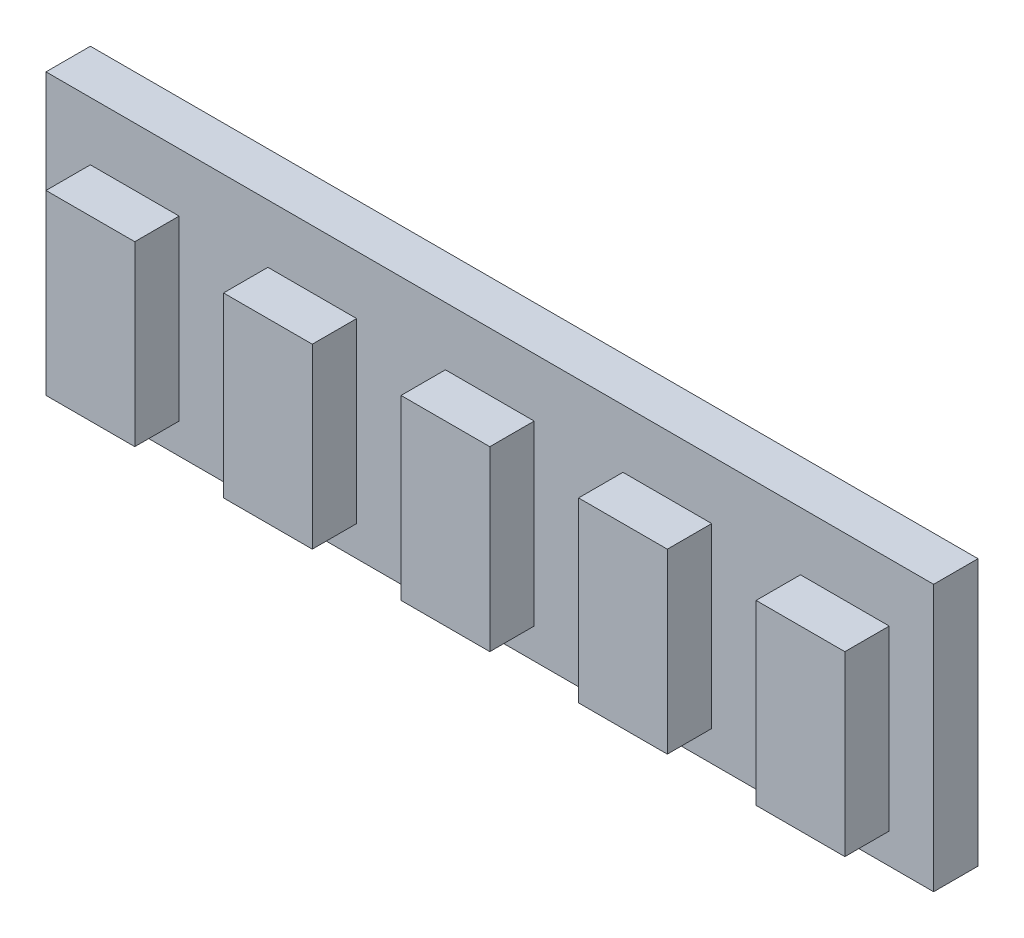
ISO-10303-21;
HEADER;
FILE_DESCRIPTION(('STEP AP214'),'2;1');
FILE_NAME('part.step','',(''),(''),'','','');
FILE_SCHEMA(('AUTOMOTIVE_DESIGN { 1 0 10303 214 1 1 1 1 }'));
ENDSEC;
DATA;
#1=APPLICATION_CONTEXT('core data for automotive mechanical design processes');
#2=APPLICATION_PROTOCOL_DEFINITION('international standard','automotive_design',2000,#1);
#3=PRODUCT_CONTEXT('',#1,'mechanical');
#4=PRODUCT('Part','Part','',(#3));
#5=PRODUCT_RELATED_PRODUCT_CATEGORY('part','',(#4));
#6=PRODUCT_DEFINITION_FORMATION('','',#4);
#7=PRODUCT_DEFINITION_CONTEXT('part definition',#1,'design');
#8=PRODUCT_DEFINITION('design','',#6,#7);
#9=PRODUCT_DEFINITION_SHAPE('','',#8);
#10=(LENGTH_UNIT() NAMED_UNIT(*) SI_UNIT(.MILLI.,.METRE.));
#11=(NAMED_UNIT(*) PLANE_ANGLE_UNIT() SI_UNIT($,.RADIAN.));
#12=(NAMED_UNIT(*) SI_UNIT($,.STERADIAN.) SOLID_ANGLE_UNIT());
#13=UNCERTAINTY_MEASURE_WITH_UNIT(LENGTH_MEASURE(1.E-05),#10,'distance_accuracy_value','');
#14=(GEOMETRIC_REPRESENTATION_CONTEXT(3) GLOBAL_UNCERTAINTY_ASSIGNED_CONTEXT((#13)) GLOBAL_UNIT_ASSIGNED_CONTEXT((#10,
#11,#12)) REPRESENTATION_CONTEXT('',''));
#15=CARTESIAN_POINT('',(0.,0.,0.));
#16=DIRECTION('',(0.,0.,1.));
#17=DIRECTION('',(1.,0.,0.));
#18=AXIS2_PLACEMENT_3D('',#15,#16,#17);
#19=CARTESIAN_POINT('',(80.,0.,10.));
#20=DIRECTION('',(0.,0.,1.));
#21=DIRECTION('',(1.,0.,0.));
#22=AXIS2_PLACEMENT_3D('',#19,#20,#21);
#23=PLANE('',#22);
#24=DIRECTION('',(0.,-1.,0.));
#25=VECTOR('',#24,1.);
#26=CARTESIAN_POINT('',(53.4403669724771,12.1433048584863,10.));
#27=LINE('',#26,#25);
#28=CARTESIAN_POINT('',(53.4403669724771,12.1433048584863,10.));
#29=VERTEX_POINT('',#28);
#30=CARTESIAN_POINT('',(53.4403669724771,-7.85669514151371,10.));
#31=VERTEX_POINT('',#30);
#32=EDGE_CURVE('E434',#29,#31,#27,.T.);
#33=ORIENTED_EDGE('',*,*,#32,.T.);
#34=DIRECTION('',(1.,0.,0.));
#35=VECTOR('',#34,1.);
#36=CARTESIAN_POINT('',(53.4403669724771,-7.85669514151371,10.));
#37=LINE('',#36,#35);
#38=CARTESIAN_POINT('',(63.4403669724771,-7.85669514151371,10.));
#39=VERTEX_POINT('',#38);
#40=EDGE_CURVE('E444',#31,#39,#37,.T.);
#41=ORIENTED_EDGE('',*,*,#40,.T.);
#42=DIRECTION('',(0.,1.,0.));
#43=VECTOR('',#42,1.);
#44=CARTESIAN_POINT('',(63.4403669724771,12.1433048584863,10.));
#45=LINE('',#44,#43);
#46=CARTESIAN_POINT('',(63.4403669724771,12.1433048584863,10.));
#47=VERTEX_POINT('',#46);
#48=EDGE_CURVE('E47',#39,#47,#45,.T.);
#49=ORIENTED_EDGE('',*,*,#48,.T.);
#50=DIRECTION('',(-1.,0.,0.));
#51=VECTOR('',#50,1.);
#52=CARTESIAN_POINT('',(53.4403669724771,12.1433048584863,10.));
#53=LINE('',#52,#51);
#54=EDGE_CURVE('E11',#47,#29,#53,.T.);
#55=ORIENTED_EDGE('',*,*,#54,.T.);
#56=EDGE_LOOP('',(#33,#41,#49,#55));
#57=FACE_BOUND('',#56,.T.);
#58=ADVANCED_FACE('F39',(#57),#23,.T.);
#59=CARTESIAN_POINT('',(53.4403669724771,12.1433048584863,10.));
#60=DIRECTION('',(0.,-1.,0.));
#61=DIRECTION('',(1.,0.,0.));
#62=AXIS2_PLACEMENT_3D('',#59,#60,#61);
#63=PLANE('',#62);
#64=DIRECTION('',(-1.,0.,0.));
#65=VECTOR('',#64,1.);
#66=CARTESIAN_POINT('',(53.4403669724771,12.1433048584863,5.));
#67=LINE('',#66,#65);
#68=CARTESIAN_POINT('',(63.4403669724771,12.1433048584863,5.));
#69=VERTEX_POINT('',#68);
#70=CARTESIAN_POINT('',(53.4403669724771,12.1433048584863,5.));
#71=VERTEX_POINT('',#70);
#72=EDGE_CURVE('E420',#69,#71,#67,.T.);
#73=ORIENTED_EDGE('',*,*,#72,.T.);
#74=DIRECTION('',(0.,0.,-1.));
#75=VECTOR('',#74,1.);
#76=CARTESIAN_POINT('',(53.4403669724771,12.1433048584863,10.));
#77=LINE('',#76,#75);
#78=EDGE_CURVE('E438',#29,#71,#77,.T.);
#79=ORIENTED_EDGE('',*,*,#78,.F.);
#80=ORIENTED_EDGE('',*,*,#54,.F.);
#81=DIRECTION('',(0.,0.,-1.));
#82=VECTOR('',#81,1.);
#83=CARTESIAN_POINT('',(63.4403669724771,12.1433048584863,10.));
#84=LINE('',#83,#82);
#85=EDGE_CURVE('E54',#47,#69,#84,.T.);
#86=ORIENTED_EDGE('',*,*,#85,.T.);
#87=EDGE_LOOP('',(#73,#79,#80,#86));
#88=FACE_BOUND('',#87,.T.);
#89=ADVANCED_FACE('F453',(#88),#63,.F.);
#90=CARTESIAN_POINT('',(63.4403669724771,12.1433048584863,10.));
#91=DIRECTION('',(-1.,0.,0.));
#92=DIRECTION('',(0.,0.,1.));
#93=AXIS2_PLACEMENT_3D('',#90,#91,#92);
#94=PLANE('',#93);
#95=DIRECTION('',(0.,1.,0.));
#96=VECTOR('',#95,1.);
#97=CARTESIAN_POINT('',(63.4403669724771,12.1433048584863,5.));
#98=LINE('',#97,#96);
#99=CARTESIAN_POINT('',(63.4403669724771,-7.85669514151371,5.));
#100=VERTEX_POINT('',#99);
#101=EDGE_CURVE('E424',#100,#69,#98,.T.);
#102=ORIENTED_EDGE('',*,*,#101,.T.);
#103=ORIENTED_EDGE('',*,*,#85,.F.);
#104=ORIENTED_EDGE('',*,*,#48,.F.);
#105=DIRECTION('',(0.,0.,-1.));
#106=VECTOR('',#105,1.);
#107=CARTESIAN_POINT('',(63.4403669724771,-7.85669514151371,10.));
#108=LINE('',#107,#106);
#109=EDGE_CURVE('E62',#39,#100,#108,.T.);
#110=ORIENTED_EDGE('',*,*,#109,.T.);
#111=EDGE_LOOP('',(#102,#103,#104,#110));
#112=FACE_BOUND('',#111,.T.);
#113=ADVANCED_FACE('F459',(#112),#94,.F.);
#114=CARTESIAN_POINT('',(53.4403669724771,-7.85669514151371,10.));
#115=DIRECTION('',(0.,1.,0.));
#116=DIRECTION('',(0.,0.,1.));
#117=AXIS2_PLACEMENT_3D('',#114,#115,#116);
#118=PLANE('',#117);
#119=DIRECTION('',(1.,0.,0.));
#120=VECTOR('',#119,1.);
#121=CARTESIAN_POINT('',(53.4403669724771,-7.85669514151371,5.));
#122=LINE('',#121,#120);
#123=CARTESIAN_POINT('',(53.4403669724771,-7.85669514151371,5.));
#124=VERTEX_POINT('',#123);
#125=EDGE_CURVE('E427',#124,#100,#122,.T.);
#126=ORIENTED_EDGE('',*,*,#125,.T.);
#127=ORIENTED_EDGE('',*,*,#109,.F.);
#128=ORIENTED_EDGE('',*,*,#40,.F.);
#129=DIRECTION('',(0.,0.,-1.));
#130=VECTOR('',#129,1.);
#131=CARTESIAN_POINT('',(53.4403669724771,-7.85669514151371,10.));
#132=LINE('',#131,#130);
#133=EDGE_CURVE('E430',#31,#124,#132,.T.);
#134=ORIENTED_EDGE('',*,*,#133,.T.);
#135=EDGE_LOOP('',(#126,#127,#128,#134));
#136=FACE_BOUND('',#135,.T.);
#137=ADVANCED_FACE('F457',(#136),#118,.F.);
#138=CARTESIAN_POINT('',(53.4403669724771,12.1433048584863,10.));
#139=DIRECTION('',(1.,0.,0.));
#140=DIRECTION('',(0.,1.,0.));
#141=AXIS2_PLACEMENT_3D('',#138,#139,#140);
#142=PLANE('',#141);
#143=DIRECTION('',(0.,-1.,0.));
#144=VECTOR('',#143,1.);
#145=CARTESIAN_POINT('',(53.4403669724771,12.1433048584863,5.));
#146=LINE('',#145,#144);
#147=EDGE_CURVE('E417',#71,#124,#146,.T.);
#148=ORIENTED_EDGE('',*,*,#147,.T.);
#149=ORIENTED_EDGE('',*,*,#133,.F.);
#150=ORIENTED_EDGE('',*,*,#32,.F.);
#151=ORIENTED_EDGE('',*,*,#78,.T.);
#152=EDGE_LOOP('',(#148,#149,#150,#151));
#153=FACE_BOUND('',#152,.T.);
#154=ADVANCED_FACE('F455',(#153),#142,.F.);
#155=CARTESIAN_POINT('',(60.,0.,10.));
#156=DIRECTION('',(0.,0.,1.));
#157=DIRECTION('',(1.,0.,0.));
#158=AXIS2_PLACEMENT_3D('',#155,#156,#157);
#159=PLANE('',#158);
#160=DIRECTION('',(0.,-1.,0.));
#161=VECTOR('',#160,1.);
#162=CARTESIAN_POINT('',(33.4403669724771,12.1433048584863,10.));
#163=LINE('',#162,#161);
#164=CARTESIAN_POINT('',(33.4403669724771,12.1433048584863,10.));
#165=VERTEX_POINT('',#164);
#166=CARTESIAN_POINT('',(33.4403669724771,-7.85669514151371,10.));
#167=VERTEX_POINT('',#166);
#168=EDGE_CURVE('E389',#165,#167,#163,.T.);
#169=ORIENTED_EDGE('',*,*,#168,.T.);
#170=DIRECTION('',(1.,0.,0.));
#171=VECTOR('',#170,1.);
#172=CARTESIAN_POINT('',(33.4403669724771,-7.85669514151371,10.));
#173=LINE('',#172,#171);
#174=CARTESIAN_POINT('',(43.4403669724771,-7.85669514151371,10.));
#175=VERTEX_POINT('',#174);
#176=EDGE_CURVE('E401',#167,#175,#173,.T.);
#177=ORIENTED_EDGE('',*,*,#176,.T.);
#178=DIRECTION('',(0.,1.,0.));
#179=VECTOR('',#178,1.);
#180=CARTESIAN_POINT('',(43.4403669724771,12.1433048584863,10.));
#181=LINE('',#180,#179);
#182=CARTESIAN_POINT('',(43.4403669724771,12.1433048584863,10.));
#183=VERTEX_POINT('',#182);
#184=EDGE_CURVE('E409',#175,#183,#181,.T.);
#185=ORIENTED_EDGE('',*,*,#184,.T.);
#186=DIRECTION('',(-1.,0.,0.));
#187=VECTOR('',#186,1.);
#188=CARTESIAN_POINT('',(33.4403669724771,12.1433048584863,10.));
#189=LINE('',#188,#187);
#190=EDGE_CURVE('E413',#183,#165,#189,.T.);
#191=ORIENTED_EDGE('',*,*,#190,.T.);
#192=EDGE_LOOP('',(#169,#177,#185,#191));
#193=FACE_BOUND('',#192,.T.);
#194=ADVANCED_FACE('F492',(#193),#159,.T.);
#195=CARTESIAN_POINT('',(33.4403669724771,12.1433048584863,10.));
#196=DIRECTION('',(0.,-1.,0.));
#197=DIRECTION('',(1.,0.,0.));
#198=AXIS2_PLACEMENT_3D('',#195,#196,#197);
#199=PLANE('',#198);
#200=DIRECTION('',(-1.,0.,0.));
#201=VECTOR('',#200,1.);
#202=CARTESIAN_POINT('',(33.4403669724771,12.1433048584863,5.));
#203=LINE('',#202,#201);
#204=CARTESIAN_POINT('',(43.4403669724771,12.1433048584863,5.));
#205=VERTEX_POINT('',#204);
#206=CARTESIAN_POINT('',(33.4403669724771,12.1433048584863,5.));
#207=VERTEX_POINT('',#206);
#208=EDGE_CURVE('E373',#205,#207,#203,.T.);
#209=ORIENTED_EDGE('',*,*,#208,.T.);
#210=DIRECTION('',(0.,0.,-1.));
#211=VECTOR('',#210,1.);
#212=CARTESIAN_POINT('',(33.4403669724771,12.1433048584863,10.));
#213=LINE('',#212,#211);
#214=EDGE_CURVE('E393',#165,#207,#213,.T.);
#215=ORIENTED_EDGE('',*,*,#214,.F.);
#216=ORIENTED_EDGE('',*,*,#190,.F.);
#217=DIRECTION('',(0.,0.,-1.));
#218=VECTOR('',#217,1.);
#219=CARTESIAN_POINT('',(43.4403669724771,12.1433048584863,10.));
#220=LINE('',#219,#218);
#221=EDGE_CURVE('E405',#183,#205,#220,.T.);
#222=ORIENTED_EDGE('',*,*,#221,.T.);
#223=EDGE_LOOP('',(#209,#215,#216,#222));
#224=FACE_BOUND('',#223,.T.);
#225=ADVANCED_FACE('F495',(#224),#199,.F.);
#226=CARTESIAN_POINT('',(43.4403669724771,12.1433048584863,10.));
#227=DIRECTION('',(-1.,0.,0.));
#228=DIRECTION('',(0.,0.,1.));
#229=AXIS2_PLACEMENT_3D('',#226,#227,#228);
#230=PLANE('',#229);
#231=DIRECTION('',(0.,1.,0.));
#232=VECTOR('',#231,1.);
#233=CARTESIAN_POINT('',(43.4403669724771,12.1433048584863,5.));
#234=LINE('',#233,#232);
#235=CARTESIAN_POINT('',(43.4403669724771,-7.85669514151371,5.));
#236=VERTEX_POINT('',#235);
#237=EDGE_CURVE('E377',#236,#205,#234,.T.);
#238=ORIENTED_EDGE('',*,*,#237,.T.);
#239=ORIENTED_EDGE('',*,*,#221,.F.);
#240=ORIENTED_EDGE('',*,*,#184,.F.);
#241=DIRECTION('',(0.,0.,-1.));
#242=VECTOR('',#241,1.);
#243=CARTESIAN_POINT('',(43.4403669724771,-7.85669514151371,10.));
#244=LINE('',#243,#242);
#245=EDGE_CURVE('E397',#175,#236,#244,.T.);
#246=ORIENTED_EDGE('',*,*,#245,.T.);
#247=EDGE_LOOP('',(#238,#239,#240,#246));
#248=FACE_BOUND('',#247,.T.);
#249=ADVANCED_FACE('F499',(#248),#230,.F.);
#250=CARTESIAN_POINT('',(33.4403669724771,-7.85669514151371,10.));
#251=DIRECTION('',(0.,1.,0.));
#252=DIRECTION('',(0.,0.,1.));
#253=AXIS2_PLACEMENT_3D('',#250,#251,#252);
#254=PLANE('',#253);
#255=DIRECTION('',(1.,0.,0.));
#256=VECTOR('',#255,1.);
#257=CARTESIAN_POINT('',(33.4403669724771,-7.85669514151371,5.));
#258=LINE('',#257,#256);
#259=CARTESIAN_POINT('',(33.4403669724771,-7.85669514151371,5.));
#260=VERTEX_POINT('',#259);
#261=EDGE_CURVE('E381',#260,#236,#258,.T.);
#262=ORIENTED_EDGE('',*,*,#261,.T.);
#263=ORIENTED_EDGE('',*,*,#245,.F.);
#264=ORIENTED_EDGE('',*,*,#176,.F.);
#265=DIRECTION('',(0.,0.,-1.));
#266=VECTOR('',#265,1.);
#267=CARTESIAN_POINT('',(33.4403669724771,-7.85669514151371,10.));
#268=LINE('',#267,#266);
#269=EDGE_CURVE('E385',#167,#260,#268,.T.);
#270=ORIENTED_EDGE('',*,*,#269,.T.);
#271=EDGE_LOOP('',(#262,#263,#264,#270));
#272=FACE_BOUND('',#271,.T.);
#273=ADVANCED_FACE('F503',(#272),#254,.F.);
#274=CARTESIAN_POINT('',(33.4403669724771,12.1433048584863,10.));
#275=DIRECTION('',(1.,0.,0.));
#276=DIRECTION('',(0.,1.,0.));
#277=AXIS2_PLACEMENT_3D('',#274,#275,#276);
#278=PLANE('',#277);
#279=DIRECTION('',(0.,-1.,0.));
#280=VECTOR('',#279,1.);
#281=CARTESIAN_POINT('',(33.4403669724771,12.1433048584863,5.));
#282=LINE('',#281,#280);
#283=EDGE_CURVE('E370',#207,#260,#282,.T.);
#284=ORIENTED_EDGE('',*,*,#283,.T.);
#285=ORIENTED_EDGE('',*,*,#269,.F.);
#286=ORIENTED_EDGE('',*,*,#168,.F.);
#287=ORIENTED_EDGE('',*,*,#214,.T.);
#288=EDGE_LOOP('',(#284,#285,#286,#287));
#289=FACE_BOUND('',#288,.T.);
#290=ADVANCED_FACE('F507',(#289),#278,.F.);
#291=CARTESIAN_POINT('',(40.,0.,10.));
#292=DIRECTION('',(0.,0.,1.));
#293=DIRECTION('',(1.,0.,0.));
#294=AXIS2_PLACEMENT_3D('',#291,#292,#293);
#295=PLANE('',#294);
#296=DIRECTION('',(0.,-1.,0.));
#297=VECTOR('',#296,1.);
#298=CARTESIAN_POINT('',(13.4403669724771,12.1433048584863,10.));
#299=LINE('',#298,#297);
#300=CARTESIAN_POINT('',(13.4403669724771,12.1433048584863,10.));
#301=VERTEX_POINT('',#300);
#302=CARTESIAN_POINT('',(13.4403669724771,-7.85669514151371,10.));
#303=VERTEX_POINT('',#302);
#304=EDGE_CURVE('E342',#301,#303,#299,.T.);
#305=ORIENTED_EDGE('',*,*,#304,.T.);
#306=DIRECTION('',(1.,0.,0.));
#307=VECTOR('',#306,1.);
#308=CARTESIAN_POINT('',(13.4403669724771,-7.85669514151371,10.));
#309=LINE('',#308,#307);
#310=CARTESIAN_POINT('',(23.4403669724771,-7.85669514151371,10.));
#311=VERTEX_POINT('',#310);
#312=EDGE_CURVE('E354',#303,#311,#309,.T.);
#313=ORIENTED_EDGE('',*,*,#312,.T.);
#314=DIRECTION('',(0.,1.,0.));
#315=VECTOR('',#314,1.);
#316=CARTESIAN_POINT('',(23.4403669724771,12.1433048584863,10.));
#317=LINE('',#316,#315);
#318=CARTESIAN_POINT('',(23.4403669724771,12.1433048584863,10.));
#319=VERTEX_POINT('',#318);
#320=EDGE_CURVE('E362',#311,#319,#317,.T.);
#321=ORIENTED_EDGE('',*,*,#320,.T.);
#322=DIRECTION('',(-1.,0.,0.));
#323=VECTOR('',#322,1.);
#324=CARTESIAN_POINT('',(13.4403669724771,12.1433048584863,10.));
#325=LINE('',#324,#323);
#326=EDGE_CURVE('E366',#319,#301,#325,.T.);
#327=ORIENTED_EDGE('',*,*,#326,.T.);
#328=EDGE_LOOP('',(#305,#313,#321,#327));
#329=FACE_BOUND('',#328,.T.);
#330=ADVANCED_FACE('F511',(#329),#295,.T.);
#331=CARTESIAN_POINT('',(13.4403669724771,12.1433048584863,10.));
#332=DIRECTION('',(0.,-1.,0.));
#333=DIRECTION('',(1.,0.,0.));
#334=AXIS2_PLACEMENT_3D('',#331,#332,#333);
#335=PLANE('',#334);
#336=DIRECTION('',(-1.,0.,0.));
#337=VECTOR('',#336,1.);
#338=CARTESIAN_POINT('',(13.4403669724771,12.1433048584863,5.));
#339=LINE('',#338,#337);
#340=CARTESIAN_POINT('',(23.4403669724771,12.1433048584863,5.));
#341=VERTEX_POINT('',#340);
#342=CARTESIAN_POINT('',(13.4403669724771,12.1433048584863,5.));
#343=VERTEX_POINT('',#342);
#344=EDGE_CURVE('E326',#341,#343,#339,.T.);
#345=ORIENTED_EDGE('',*,*,#344,.T.);
#346=DIRECTION('',(0.,0.,-1.));
#347=VECTOR('',#346,1.);
#348=CARTESIAN_POINT('',(13.4403669724771,12.1433048584863,10.));
#349=LINE('',#348,#347);
#350=EDGE_CURVE('E346',#301,#343,#349,.T.);
#351=ORIENTED_EDGE('',*,*,#350,.F.);
#352=ORIENTED_EDGE('',*,*,#326,.F.);
#353=DIRECTION('',(0.,0.,-1.));
#354=VECTOR('',#353,1.);
#355=CARTESIAN_POINT('',(23.4403669724771,12.1433048584863,10.));
#356=LINE('',#355,#354);
#357=EDGE_CURVE('E358',#319,#341,#356,.T.);
#358=ORIENTED_EDGE('',*,*,#357,.T.);
#359=EDGE_LOOP('',(#345,#351,#352,#358));
#360=FACE_BOUND('',#359,.T.);
#361=ADVANCED_FACE('F515',(#360),#335,.F.);
#362=CARTESIAN_POINT('',(23.4403669724771,12.1433048584863,10.));
#363=DIRECTION('',(-1.,0.,0.));
#364=DIRECTION('',(0.,0.,1.));
#365=AXIS2_PLACEMENT_3D('',#362,#363,#364);
#366=PLANE('',#365);
#367=DIRECTION('',(0.,1.,0.));
#368=VECTOR('',#367,1.);
#369=CARTESIAN_POINT('',(23.4403669724771,12.1433048584863,5.));
#370=LINE('',#369,#368);
#371=CARTESIAN_POINT('',(23.4403669724771,-7.85669514151371,5.));
#372=VERTEX_POINT('',#371);
#373=EDGE_CURVE('E330',#372,#341,#370,.T.);
#374=ORIENTED_EDGE('',*,*,#373,.T.);
#375=ORIENTED_EDGE('',*,*,#357,.F.);
#376=ORIENTED_EDGE('',*,*,#320,.F.);
#377=DIRECTION('',(0.,0.,-1.));
#378=VECTOR('',#377,1.);
#379=CARTESIAN_POINT('',(23.4403669724771,-7.85669514151371,10.));
#380=LINE('',#379,#378);
#381=EDGE_CURVE('E350',#311,#372,#380,.T.);
#382=ORIENTED_EDGE('',*,*,#381,.T.);
#383=EDGE_LOOP('',(#374,#375,#376,#382));
#384=FACE_BOUND('',#383,.T.);
#385=ADVANCED_FACE('F519',(#384),#366,.F.);
#386=CARTESIAN_POINT('',(13.4403669724771,-7.85669514151371,10.));
#387=DIRECTION('',(0.,1.,0.));
#388=DIRECTION('',(0.,0.,1.));
#389=AXIS2_PLACEMENT_3D('',#386,#387,#388);
#390=PLANE('',#389);
#391=DIRECTION('',(1.,0.,0.));
#392=VECTOR('',#391,1.);
#393=CARTESIAN_POINT('',(13.4403669724771,-7.85669514151371,5.));
#394=LINE('',#393,#392);
#395=CARTESIAN_POINT('',(13.4403669724771,-7.85669514151371,5.));
#396=VERTEX_POINT('',#395);
#397=EDGE_CURVE('E334',#396,#372,#394,.T.);
#398=ORIENTED_EDGE('',*,*,#397,.T.);
#399=ORIENTED_EDGE('',*,*,#381,.F.);
#400=ORIENTED_EDGE('',*,*,#312,.F.);
#401=DIRECTION('',(0.,0.,-1.));
#402=VECTOR('',#401,1.);
#403=CARTESIAN_POINT('',(13.4403669724771,-7.85669514151371,10.));
#404=LINE('',#403,#402);
#405=EDGE_CURVE('E338',#303,#396,#404,.T.);
#406=ORIENTED_EDGE('',*,*,#405,.T.);
#407=EDGE_LOOP('',(#398,#399,#400,#406));
#408=FACE_BOUND('',#407,.T.);
#409=ADVANCED_FACE('F473',(#408),#390,.F.);
#410=CARTESIAN_POINT('',(13.4403669724771,12.1433048584863,10.));
#411=DIRECTION('',(1.,0.,0.));
#412=DIRECTION('',(0.,1.,0.));
#413=AXIS2_PLACEMENT_3D('',#410,#411,#412);
#414=PLANE('',#413);
#415=DIRECTION('',(0.,-1.,0.));
#416=VECTOR('',#415,1.);
#417=CARTESIAN_POINT('',(13.4403669724771,12.1433048584863,5.));
#418=LINE('',#417,#416);
#419=EDGE_CURVE('E323',#343,#396,#418,.T.);
#420=ORIENTED_EDGE('',*,*,#419,.T.);
#421=ORIENTED_EDGE('',*,*,#405,.F.);
#422=ORIENTED_EDGE('',*,*,#304,.F.);
#423=ORIENTED_EDGE('',*,*,#350,.T.);
#424=EDGE_LOOP('',(#420,#421,#422,#423));
#425=FACE_BOUND('',#424,.T.);
#426=ADVANCED_FACE('F463',(#425),#414,.F.);
#427=CARTESIAN_POINT('',(0.,0.,5.));
#428=DIRECTION('',(0.,0.,1.));
#429=DIRECTION('',(1.,0.,0.));
#430=AXIS2_PLACEMENT_3D('',#427,#428,#429);
#431=PLANE('',#430);
#432=DIRECTION('',(0.,-1.,0.));
#433=VECTOR('',#432,1.);
#434=CARTESIAN_POINT('',(-31.5596330275229,18.7155963302752,5.));
#435=LINE('',#434,#433);
#436=CARTESIAN_POINT('',(-31.5596330275229,18.7155963302752,5.));
#437=VERTEX_POINT('',#436);
#438=CARTESIAN_POINT('',(-31.5596330275229,-11.2844036697248,5.));
#439=VERTEX_POINT('',#438);
#440=EDGE_CURVE('E282',#437,#439,#435,.T.);
#441=ORIENTED_EDGE('',*,*,#440,.T.);
#442=DIRECTION('',(1.,0.,0.));
#443=VECTOR('',#442,1.);
#444=CARTESIAN_POINT('',(-31.5596330275229,-11.2844036697248,5.));
#445=LINE('',#444,#443);
#446=CARTESIAN_POINT('',(68.4403669724771,-11.2844036697248,5.));
#447=VERTEX_POINT('',#446);
#448=EDGE_CURVE('E286',#439,#447,#445,.T.);
#449=ORIENTED_EDGE('',*,*,#448,.T.);
#450=DIRECTION('',(0.,1.,0.));
#451=VECTOR('',#450,1.);
#452=CARTESIAN_POINT('',(68.4403669724771,18.7155963302752,5.));
#453=LINE('',#452,#451);
#454=CARTESIAN_POINT('',(68.4403669724771,18.7155963302752,5.));
#455=VERTEX_POINT('',#454);
#456=EDGE_CURVE('E290',#447,#455,#453,.T.);
#457=ORIENTED_EDGE('',*,*,#456,.T.);
#458=DIRECTION('',(-1.,0.,0.));
#459=VECTOR('',#458,1.);
#460=CARTESIAN_POINT('',(-31.5596330275229,18.7155963302752,5.));
#461=LINE('',#460,#459);
#462=EDGE_CURVE('E293',#455,#437,#461,.T.);
#463=ORIENTED_EDGE('',*,*,#462,.T.);
#464=EDGE_LOOP('',(#441,#449,#457,#463));
#465=FACE_BOUND('',#464,.T.);
#466=DIRECTION('',(1.,0.,0.));
#467=VECTOR('',#466,1.);
#468=CARTESIAN_POINT('',(-26.5596330275229,-7.85669514151371,5.));
#469=LINE('',#468,#467);
#470=CARTESIAN_POINT('',(-26.5596330275229,-7.85669514151371,5.));
#471=VERTEX_POINT('',#470);
#472=CARTESIAN_POINT('',(-16.5596330275229,-7.85669514151371,5.));
#473=VERTEX_POINT('',#472);
#474=EDGE_CURVE('E259',#471,#473,#469,.T.);
#475=ORIENTED_EDGE('',*,*,#474,.F.);
#476=DIRECTION('',(0.,-1.,0.));
#477=VECTOR('',#476,1.);
#478=CARTESIAN_POINT('',(-26.5596330275229,12.1433048584863,5.));
#479=LINE('',#478,#477);
#480=CARTESIAN_POINT('',(-26.5596330275229,12.1433048584863,5.));
#481=VERTEX_POINT('',#480);
#482=EDGE_CURVE('E236',#481,#471,#479,.T.);
#483=ORIENTED_EDGE('',*,*,#482,.F.);
#484=DIRECTION('',(-1.,0.,0.));
#485=VECTOR('',#484,1.);
#486=CARTESIAN_POINT('',(-26.5596330275229,12.1433048584863,5.));
#487=LINE('',#486,#485);
#488=CARTESIAN_POINT('',(-16.5596330275229,12.1433048584863,5.));
#489=VERTEX_POINT('',#488);
#490=EDGE_CURVE('E246',#489,#481,#487,.T.);
#491=ORIENTED_EDGE('',*,*,#490,.F.);
#492=DIRECTION('',(0.,1.,0.));
#493=VECTOR('',#492,1.);
#494=CARTESIAN_POINT('',(-16.5596330275229,12.1433048584863,5.));
#495=LINE('',#494,#493);
#496=EDGE_CURVE('E262',#473,#489,#495,.T.);
#497=ORIENTED_EDGE('',*,*,#496,.F.);
#498=EDGE_LOOP('',(#475,#483,#491,#497));
#499=FACE_BOUND('',#498,.T.);
#500=DIRECTION('',(1.,0.,0.));
#501=VECTOR('',#500,1.);
#502=CARTESIAN_POINT('',(-6.55963302752293,-7.85669514151371,5.));
#503=LINE('',#502,#501);
#504=CARTESIAN_POINT('',(-6.55963302752293,-7.85669514151371,5.));
#505=VERTEX_POINT('',#504);
#506=CARTESIAN_POINT('',(3.44036697247707,-7.85669514151371,5.));
#507=VERTEX_POINT('',#506);
#508=EDGE_CURVE('E232',#505,#507,#503,.T.);
#509=ORIENTED_EDGE('',*,*,#508,.F.);
#510=DIRECTION('',(0.,-1.,0.));
#511=VECTOR('',#510,1.);
#512=CARTESIAN_POINT('',(-6.55963302752293,12.1433048584863,5.));
#513=LINE('',#512,#511);
#514=CARTESIAN_POINT('',(-6.55963302752293,12.1433048584863,5.));
#515=VERTEX_POINT('',#514);
#516=EDGE_CURVE('E229',#515,#505,#513,.T.);
#517=ORIENTED_EDGE('',*,*,#516,.F.);
#518=DIRECTION('',(-1.,0.,0.));
#519=VECTOR('',#518,1.);
#520=CARTESIAN_POINT('',(-6.55963302752293,12.1433048584863,5.));
#521=LINE('',#520,#519);
#522=CARTESIAN_POINT('',(3.44036697247707,12.1433048584863,5.));
#523=VERTEX_POINT('',#522);
#524=EDGE_CURVE('E215',#523,#515,#521,.T.);
#525=ORIENTED_EDGE('',*,*,#524,.F.);
#526=DIRECTION('',(0.,1.,0.));
#527=VECTOR('',#526,1.);
#528=CARTESIAN_POINT('',(3.44036697247707,12.1433048584863,5.));
#529=LINE('',#528,#527);
#530=EDGE_CURVE('E775',#507,#523,#529,.T.);
#531=ORIENTED_EDGE('',*,*,#530,.F.);
#532=EDGE_LOOP('',(#509,#517,#525,#531));
#533=FACE_BOUND('',#532,.T.);
#534=ORIENTED_EDGE('',*,*,#419,.F.);
#535=ORIENTED_EDGE('',*,*,#344,.F.);
#536=ORIENTED_EDGE('',*,*,#373,.F.);
#537=ORIENTED_EDGE('',*,*,#397,.F.);
#538=EDGE_LOOP('',(#534,#535,#536,#537));
#539=FACE_BOUND('',#538,.T.);
#540=ORIENTED_EDGE('',*,*,#283,.F.);
#541=ORIENTED_EDGE('',*,*,#208,.F.);
#542=ORIENTED_EDGE('',*,*,#237,.F.);
#543=ORIENTED_EDGE('',*,*,#261,.F.);
#544=EDGE_LOOP('',(#540,#541,#542,#543));
#545=FACE_BOUND('',#544,.T.);
#546=ORIENTED_EDGE('',*,*,#147,.F.);
#547=ORIENTED_EDGE('',*,*,#72,.F.);
#548=ORIENTED_EDGE('',*,*,#101,.F.);
#549=ORIENTED_EDGE('',*,*,#125,.F.);
#550=EDGE_LOOP('',(#546,#547,#548,#549));
#551=FACE_BOUND('',#550,.T.);
#552=ADVANCED_FACE('F460',(#465,#499,#533,#539,#545,#551),#431,.T.);
#553=CARTESIAN_POINT('',(-31.5596330275229,18.7155963302752,5.));
#554=DIRECTION('',(1.,0.,0.));
#555=DIRECTION('',(0.,0.,-1.));
#556=AXIS2_PLACEMENT_3D('',#553,#554,#555);
#557=PLANE('',#556);
#558=DIRECTION('',(0.,-1.,0.));
#559=VECTOR('',#558,1.);
#560=CARTESIAN_POINT('',(-31.5596330275229,18.7155963302752,0.));
#561=LINE('',#560,#559);
#562=CARTESIAN_POINT('',(-31.5596330275229,18.7155963302752,0.));
#563=VERTEX_POINT('',#562);
#564=CARTESIAN_POINT('',(-31.5596330275229,-11.2844036697248,0.));
#565=VERTEX_POINT('',#564);
#566=EDGE_CURVE('E281',#563,#565,#561,.T.);
#567=ORIENTED_EDGE('',*,*,#566,.T.);
#568=DIRECTION('',(0.,0.,-1.));
#569=VECTOR('',#568,1.);
#570=CARTESIAN_POINT('',(-31.5596330275229,-11.2844036697248,5.));
#571=LINE('',#570,#569);
#572=EDGE_CURVE('E319',#439,#565,#571,.T.);
#573=ORIENTED_EDGE('',*,*,#572,.F.);
#574=ORIENTED_EDGE('',*,*,#440,.F.);
#575=DIRECTION('',(0.,0.,-1.));
#576=VECTOR('',#575,1.);
#577=CARTESIAN_POINT('',(-31.5596330275229,18.7155963302752,5.));
#578=LINE('',#577,#576);
#579=EDGE_CURVE('E296',#437,#563,#578,.T.);
#580=ORIENTED_EDGE('',*,*,#579,.T.);
#581=EDGE_LOOP('',(#567,#573,#574,#580));
#582=FACE_BOUND('',#581,.T.);
#583=ADVANCED_FACE('F462',(#582),#557,.F.);
#584=CARTESIAN_POINT('',(-31.5596330275229,-11.2844036697248,5.));
#585=DIRECTION('',(0.,1.,0.));
#586=DIRECTION('',(0.,0.,1.));
#587=AXIS2_PLACEMENT_3D('',#584,#585,#586);
#588=PLANE('',#587);
#589=DIRECTION('',(1.,0.,0.));
#590=VECTOR('',#589,1.);
#591=CARTESIAN_POINT('',(-31.5596330275229,-11.2844036697248,0.));
#592=LINE('',#591,#590);
#593=CARTESIAN_POINT('',(68.4403669724771,-11.2844036697248,0.));
#594=VERTEX_POINT('',#593);
#595=EDGE_CURVE('E300',#565,#594,#592,.T.);
#596=ORIENTED_EDGE('',*,*,#595,.T.);
#597=DIRECTION('',(0.,0.,-1.));
#598=VECTOR('',#597,1.);
#599=CARTESIAN_POINT('',(68.4403669724771,-11.2844036697248,5.));
#600=LINE('',#599,#598);
#601=EDGE_CURVE('E315',#447,#594,#600,.T.);
#602=ORIENTED_EDGE('',*,*,#601,.F.);
#603=ORIENTED_EDGE('',*,*,#448,.F.);
#604=ORIENTED_EDGE('',*,*,#572,.T.);
#605=EDGE_LOOP('',(#596,#602,#603,#604));
#606=FACE_BOUND('',#605,.T.);
#607=ADVANCED_FACE('F470',(#606),#588,.F.);
#608=CARTESIAN_POINT('',(68.4403669724771,18.7155963302752,5.));
#609=DIRECTION('',(-1.,0.,0.));
#610=DIRECTION('',(0.,0.,1.));
#611=AXIS2_PLACEMENT_3D('',#608,#609,#610);
#612=PLANE('',#611);
#613=DIRECTION('',(0.,1.,0.));
#614=VECTOR('',#613,1.);
#615=CARTESIAN_POINT('',(68.4403669724771,18.7155963302752,0.));
#616=LINE('',#615,#614);
#617=CARTESIAN_POINT('',(68.4403669724771,18.7155963302752,0.));
#618=VERTEX_POINT('',#617);
#619=EDGE_CURVE('E303',#594,#618,#616,.T.);
#620=ORIENTED_EDGE('',*,*,#619,.T.);
#621=DIRECTION('',(0.,0.,-1.));
#622=VECTOR('',#621,1.);
#623=CARTESIAN_POINT('',(68.4403669724771,18.7155963302752,5.));
#624=LINE('',#623,#622);
#625=EDGE_CURVE('E311',#455,#618,#624,.T.);
#626=ORIENTED_EDGE('',*,*,#625,.F.);
#627=ORIENTED_EDGE('',*,*,#456,.F.);
#628=ORIENTED_EDGE('',*,*,#601,.T.);
#629=EDGE_LOOP('',(#620,#626,#627,#628));
#630=FACE_BOUND('',#629,.T.);
#631=ADVANCED_FACE('F529',(#630),#612,.F.);
#632=CARTESIAN_POINT('',(-31.5596330275229,18.7155963302752,5.));
#633=DIRECTION('',(0.,-1.,0.));
#634=DIRECTION('',(0.,0.,-1.));
#635=AXIS2_PLACEMENT_3D('',#632,#633,#634);
#636=PLANE('',#635);
#637=DIRECTION('',(-1.,0.,0.));
#638=VECTOR('',#637,1.);
#639=CARTESIAN_POINT('',(-31.5596330275229,18.7155963302752,0.));
#640=LINE('',#639,#638);
#641=EDGE_CURVE('E287',#618,#563,#640,.T.);
#642=ORIENTED_EDGE('',*,*,#641,.T.);
#643=ORIENTED_EDGE('',*,*,#579,.F.);
#644=ORIENTED_EDGE('',*,*,#462,.F.);
#645=ORIENTED_EDGE('',*,*,#625,.T.);
#646=EDGE_LOOP('',(#642,#643,#644,#645));
#647=FACE_BOUND('',#646,.T.);
#648=ADVANCED_FACE('F533',(#647),#636,.F.);
#649=CARTESIAN_POINT('',(0.,0.,0.));
#650=DIRECTION('',(0.,0.,1.));
#651=DIRECTION('',(1.,0.,0.));
#652=AXIS2_PLACEMENT_3D('',#649,#650,#651);
#653=PLANE('',#652);
#654=ORIENTED_EDGE('',*,*,#566,.F.);
#655=ORIENTED_EDGE('',*,*,#641,.F.);
#656=ORIENTED_EDGE('',*,*,#619,.F.);
#657=ORIENTED_EDGE('',*,*,#595,.F.);
#658=EDGE_LOOP('',(#654,#655,#656,#657));
#659=FACE_BOUND('',#658,.T.);
#660=ADVANCED_FACE('F536',(#659),#653,.F.);
#661=CARTESIAN_POINT('',(-26.5596330275229,12.1433048584863,10.));
#662=DIRECTION('',(1.,0.,0.));
#663=DIRECTION('',(0.,1.,0.));
#664=AXIS2_PLACEMENT_3D('',#661,#662,#663);
#665=PLANE('',#664);
#666=ORIENTED_EDGE('',*,*,#482,.T.);
#667=DIRECTION('',(0.,0.,-1.));
#668=VECTOR('',#667,1.);
#669=CARTESIAN_POINT('',(-26.5596330275229,-7.85669514151371,10.));
#670=LINE('',#669,#668);
#671=CARTESIAN_POINT('',(-26.5596330275229,-7.85669514151371,10.));
#672=VERTEX_POINT('',#671);
#673=EDGE_CURVE('E278',#672,#471,#670,.T.);
#674=ORIENTED_EDGE('',*,*,#673,.F.);
#675=DIRECTION('',(0.,-1.,0.));
#676=VECTOR('',#675,1.);
#677=CARTESIAN_POINT('',(-26.5596330275229,12.1433048584863,10.));
#678=LINE('',#677,#676);
#679=CARTESIAN_POINT('',(-26.5596330275229,12.1433048584863,10.));
#680=VERTEX_POINT('',#679);
#681=EDGE_CURVE('E241',#680,#672,#678,.T.);
#682=ORIENTED_EDGE('',*,*,#681,.F.);
#683=DIRECTION('',(0.,0.,-1.));
#684=VECTOR('',#683,1.);
#685=CARTESIAN_POINT('',(-26.5596330275229,12.1433048584863,10.));
#686=LINE('',#685,#684);
#687=EDGE_CURVE('E255',#680,#481,#686,.T.);
#688=ORIENTED_EDGE('',*,*,#687,.T.);
#689=EDGE_LOOP('',(#666,#674,#682,#688));
#690=FACE_BOUND('',#689,.T.);
#691=ADVANCED_FACE('F539',(#690),#665,.F.);
#692=CARTESIAN_POINT('',(-26.5596330275229,-7.85669514151371,10.));
#693=DIRECTION('',(0.,1.,0.));
#694=DIRECTION('',(0.,0.,1.));
#695=AXIS2_PLACEMENT_3D('',#692,#693,#694);
#696=PLANE('',#695);
#697=ORIENTED_EDGE('',*,*,#474,.T.);
#698=DIRECTION('',(0.,0.,-1.));
#699=VECTOR('',#698,1.);
#700=CARTESIAN_POINT('',(-16.5596330275229,-7.85669514151371,10.));
#701=LINE('',#700,#699);
#702=CARTESIAN_POINT('',(-16.5596330275229,-7.85669514151371,10.));
#703=VERTEX_POINT('',#702);
#704=EDGE_CURVE('E274',#703,#473,#701,.T.);
#705=ORIENTED_EDGE('',*,*,#704,.F.);
#706=DIRECTION('',(1.,0.,0.));
#707=VECTOR('',#706,1.);
#708=CARTESIAN_POINT('',(-26.5596330275229,-7.85669514151371,10.));
#709=LINE('',#708,#707);
#710=EDGE_CURVE('E245',#672,#703,#709,.T.);
#711=ORIENTED_EDGE('',*,*,#710,.F.);
#712=ORIENTED_EDGE('',*,*,#673,.T.);
#713=EDGE_LOOP('',(#697,#705,#711,#712));
#714=FACE_BOUND('',#713,.T.);
#715=ADVANCED_FACE('F544',(#714),#696,.F.);
#716=CARTESIAN_POINT('',(-16.5596330275229,12.1433048584863,10.));
#717=DIRECTION('',(-1.,0.,0.));
#718=DIRECTION('',(0.,0.,1.));
#719=AXIS2_PLACEMENT_3D('',#716,#717,#718);
#720=PLANE('',#719);
#721=ORIENTED_EDGE('',*,*,#496,.T.);
#722=DIRECTION('',(0.,0.,-1.));
#723=VECTOR('',#722,1.);
#724=CARTESIAN_POINT('',(-16.5596330275229,12.1433048584863,10.));
#725=LINE('',#724,#723);
#726=CARTESIAN_POINT('',(-16.5596330275229,12.1433048584863,10.));
#727=VERTEX_POINT('',#726);
#728=EDGE_CURVE('E271',#727,#489,#725,.T.);
#729=ORIENTED_EDGE('',*,*,#728,.F.);
#730=DIRECTION('',(0.,1.,0.));
#731=VECTOR('',#730,1.);
#732=CARTESIAN_POINT('',(-16.5596330275229,12.1433048584863,10.));
#733=LINE('',#732,#731);
#734=EDGE_CURVE('E249',#703,#727,#733,.T.);
#735=ORIENTED_EDGE('',*,*,#734,.F.);
#736=ORIENTED_EDGE('',*,*,#704,.T.);
#737=EDGE_LOOP('',(#721,#729,#735,#736));
#738=FACE_BOUND('',#737,.T.);
#739=ADVANCED_FACE('F559',(#738),#720,.F.);
#740=CARTESIAN_POINT('',(-26.5596330275229,12.1433048584863,10.));
#741=DIRECTION('',(0.,-1.,0.));
#742=DIRECTION('',(1.,0.,0.));
#743=AXIS2_PLACEMENT_3D('',#740,#741,#742);
#744=PLANE('',#743);
#745=ORIENTED_EDGE('',*,*,#490,.T.);
#746=ORIENTED_EDGE('',*,*,#687,.F.);
#747=DIRECTION('',(-1.,0.,0.));
#748=VECTOR('',#747,1.);
#749=CARTESIAN_POINT('',(-26.5596330275229,12.1433048584863,10.));
#750=LINE('',#749,#748);
#751=EDGE_CURVE('E252',#727,#680,#750,.T.);
#752=ORIENTED_EDGE('',*,*,#751,.F.);
#753=ORIENTED_EDGE('',*,*,#728,.T.);
#754=EDGE_LOOP('',(#745,#746,#752,#753));
#755=FACE_BOUND('',#754,.T.);
#756=ADVANCED_FACE('F565',(#755),#744,.F.);
#757=CARTESIAN_POINT('',(0.,0.,10.));
#758=DIRECTION('',(0.,0.,1.));
#759=DIRECTION('',(1.,0.,0.));
#760=AXIS2_PLACEMENT_3D('',#757,#758,#759);
#761=PLANE('',#760);
#762=ORIENTED_EDGE('',*,*,#681,.T.);
#763=ORIENTED_EDGE('',*,*,#710,.T.);
#764=ORIENTED_EDGE('',*,*,#734,.T.);
#765=ORIENTED_EDGE('',*,*,#751,.T.);
#766=EDGE_LOOP('',(#762,#763,#764,#765));
#767=FACE_BOUND('',#766,.T.);
#768=ADVANCED_FACE('F569',(#767),#761,.T.);
#769=CARTESIAN_POINT('',(-6.55963302752293,12.1433048584863,10.));
#770=DIRECTION('',(1.,0.,0.));
#771=DIRECTION('',(0.,1.,0.));
#772=AXIS2_PLACEMENT_3D('',#769,#770,#771);
#773=PLANE('',#772);
#774=ORIENTED_EDGE('',*,*,#516,.T.);
#775=DIRECTION('',(0.,0.,-1.));
#776=VECTOR('',#775,1.);
#777=CARTESIAN_POINT('',(-6.55963302752293,-7.85669514151371,10.));
#778=LINE('',#777,#776);
#779=CARTESIAN_POINT('',(-6.55963302752293,-7.85669514151371,10.));
#780=VERTEX_POINT('',#779);
#781=EDGE_CURVE('E221',#780,#505,#778,.T.);
#782=ORIENTED_EDGE('',*,*,#781,.F.);
#783=DIRECTION('',(0.,-1.,0.));
#784=VECTOR('',#783,1.);
#785=CARTESIAN_POINT('',(-6.55963302752293,12.1433048584863,10.));
#786=LINE('',#785,#784);
#787=CARTESIAN_POINT('',(-6.55963302752293,12.1433048584863,10.));
#788=VERTEX_POINT('',#787);
#789=EDGE_CURVE('E203',#788,#780,#786,.T.);
#790=ORIENTED_EDGE('',*,*,#789,.F.);
#791=DIRECTION('',(0.,0.,-1.));
#792=VECTOR('',#791,1.);
#793=CARTESIAN_POINT('',(-6.55963302752293,12.1433048584863,10.));
#794=LINE('',#793,#792);
#795=EDGE_CURVE('E765',#788,#515,#794,.T.);
#796=ORIENTED_EDGE('',*,*,#795,.T.);
#797=EDGE_LOOP('',(#774,#782,#790,#796));
#798=FACE_BOUND('',#797,.T.);
#799=ADVANCED_FACE('F227',(#798),#773,.F.);
#800=CARTESIAN_POINT('',(-6.55963302752293,-7.85669514151371,10.));
#801=DIRECTION('',(0.,1.,0.));
#802=DIRECTION('',(0.,0.,1.));
#803=AXIS2_PLACEMENT_3D('',#800,#801,#802);
#804=PLANE('',#803);
#805=ORIENTED_EDGE('',*,*,#508,.T.);
#806=DIRECTION('',(0.,0.,-1.));
#807=VECTOR('',#806,1.);
#808=CARTESIAN_POINT('',(3.44036697247707,-7.85669514151371,10.));
#809=LINE('',#808,#807);
#810=CARTESIAN_POINT('',(3.44036697247707,-7.85669514151371,10.));
#811=VERTEX_POINT('',#810);
#812=EDGE_CURVE('E223',#811,#507,#809,.T.);
#813=ORIENTED_EDGE('',*,*,#812,.F.);
#814=DIRECTION('',(1.,0.,0.));
#815=VECTOR('',#814,1.);
#816=CARTESIAN_POINT('',(-6.55963302752293,-7.85669514151371,10.));
#817=LINE('',#816,#815);
#818=EDGE_CURVE('E206',#780,#811,#817,.T.);
#819=ORIENTED_EDGE('',*,*,#818,.F.);
#820=ORIENTED_EDGE('',*,*,#781,.T.);
#821=EDGE_LOOP('',(#805,#813,#819,#820));
#822=FACE_BOUND('',#821,.T.);
#823=ADVANCED_FACE('F220',(#822),#804,.F.);
#824=CARTESIAN_POINT('',(3.44036697247707,12.1433048584863,10.));
#825=DIRECTION('',(-1.,0.,0.));
#826=DIRECTION('',(0.,0.,1.));
#827=AXIS2_PLACEMENT_3D('',#824,#825,#826);
#828=PLANE('',#827);
#829=ORIENTED_EDGE('',*,*,#530,.T.);
#830=DIRECTION('',(0.,0.,-1.));
#831=VECTOR('',#830,1.);
#832=CARTESIAN_POINT('',(3.44036697247707,12.1433048584863,10.));
#833=LINE('',#832,#831);
#834=CARTESIAN_POINT('',(3.44036697247707,12.1433048584863,10.));
#835=VERTEX_POINT('',#834);
#836=EDGE_CURVE('E767',#835,#523,#833,.T.);
#837=ORIENTED_EDGE('',*,*,#836,.F.);
#838=DIRECTION('',(0.,1.,0.));
#839=VECTOR('',#838,1.);
#840=CARTESIAN_POINT('',(3.44036697247707,12.1433048584863,10.));
#841=LINE('',#840,#839);
#842=EDGE_CURVE('E225',#811,#835,#841,.T.);
#843=ORIENTED_EDGE('',*,*,#842,.F.);
#844=ORIENTED_EDGE('',*,*,#812,.T.);
#845=EDGE_LOOP('',(#829,#837,#843,#844));
#846=FACE_BOUND('',#845,.T.);
#847=ADVANCED_FACE('F578',(#846),#828,.F.);
#848=CARTESIAN_POINT('',(-6.55963302752293,12.1433048584863,10.));
#849=DIRECTION('',(0.,-1.,0.));
#850=DIRECTION('',(1.,0.,0.));
#851=AXIS2_PLACEMENT_3D('',#848,#849,#850);
#852=PLANE('',#851);
#853=ORIENTED_EDGE('',*,*,#524,.T.);
#854=ORIENTED_EDGE('',*,*,#795,.F.);
#855=DIRECTION('',(-1.,0.,0.));
#856=VECTOR('',#855,1.);
#857=CARTESIAN_POINT('',(-6.55963302752293,12.1433048584863,10.));
#858=LINE('',#857,#856);
#859=EDGE_CURVE('E209',#835,#788,#858,.T.);
#860=ORIENTED_EDGE('',*,*,#859,.F.);
#861=ORIENTED_EDGE('',*,*,#836,.T.);
#862=EDGE_LOOP('',(#853,#854,#860,#861));
#863=FACE_BOUND('',#862,.T.);
#864=ADVANCED_FACE('F581',(#863),#852,.F.);
#865=CARTESIAN_POINT('',(20.,0.,10.));
#866=DIRECTION('',(0.,0.,1.));
#867=DIRECTION('',(1.,0.,0.));
#868=AXIS2_PLACEMENT_3D('',#865,#866,#867);
#869=PLANE('',#868);
#870=ORIENTED_EDGE('',*,*,#789,.T.);
#871=ORIENTED_EDGE('',*,*,#818,.T.);
#872=ORIENTED_EDGE('',*,*,#842,.T.);
#873=ORIENTED_EDGE('',*,*,#859,.T.);
#874=EDGE_LOOP('',(#870,#871,#872,#873));
#875=FACE_BOUND('',#874,.T.);
#876=ADVANCED_FACE('F205',(#875),#869,.T.);
#877=CLOSED_SHELL('',(#58,#89,#113,#137,#154,#194,#225,#249,#273,#290,#330,#361,#385,#409,#426,
#552,#583,#607,#631,#648,#660,#691,#715,#739,#756,#768,#799,#823,#847,#864,#876));
#878=MANIFOLD_SOLID_BREP('B2',#877);
#879=ADVANCED_BREP_SHAPE_REPRESENTATION('',(#18,#878),#14);
#880=SHAPE_DEFINITION_REPRESENTATION(#9,#879);
ENDSEC;
END-ISO-10303-21;
